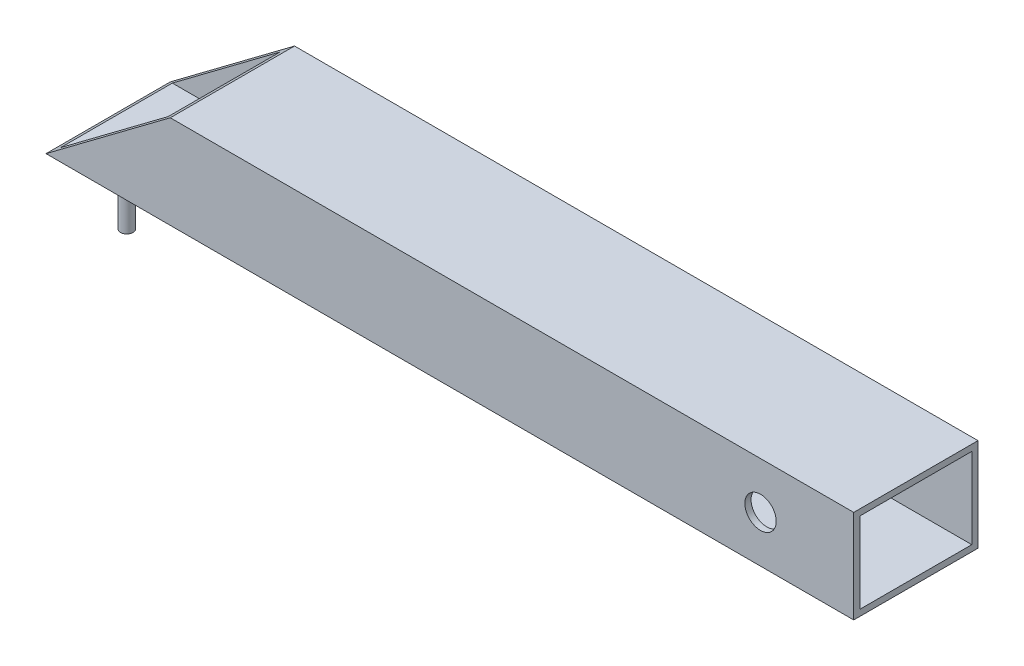
ISO-10303-21;
HEADER;
FILE_DESCRIPTION(('STEP AP214'),'2;1');
FILE_NAME('part.step','',(''),(''),'','','');
FILE_SCHEMA(('AUTOMOTIVE_DESIGN { 1 0 10303 214 1 1 1 1 }'));
ENDSEC;
DATA;
#1=APPLICATION_CONTEXT('core data for automotive mechanical design processes');
#2=APPLICATION_PROTOCOL_DEFINITION('international standard','automotive_design',2000,#1);
#3=PRODUCT_CONTEXT('',#1,'mechanical');
#4=PRODUCT('Part','Part','',(#3));
#5=PRODUCT_RELATED_PRODUCT_CATEGORY('part','',(#4));
#6=PRODUCT_DEFINITION_FORMATION('','',#4);
#7=PRODUCT_DEFINITION_CONTEXT('part definition',#1,'design');
#8=PRODUCT_DEFINITION('design','',#6,#7);
#9=PRODUCT_DEFINITION_SHAPE('','',#8);
#10=(LENGTH_UNIT() NAMED_UNIT(*) SI_UNIT(.MILLI.,.METRE.));
#11=(NAMED_UNIT(*) PLANE_ANGLE_UNIT() SI_UNIT($,.RADIAN.));
#12=(NAMED_UNIT(*) SI_UNIT($,.STERADIAN.) SOLID_ANGLE_UNIT());
#13=UNCERTAINTY_MEASURE_WITH_UNIT(LENGTH_MEASURE(1.E-05),#10,'distance_accuracy_value','');
#14=(GEOMETRIC_REPRESENTATION_CONTEXT(3) GLOBAL_UNCERTAINTY_ASSIGNED_CONTEXT((#13)) GLOBAL_UNIT_ASSIGNED_CONTEXT((#10,
#11,#12)) REPRESENTATION_CONTEXT('',''));
#15=CARTESIAN_POINT('',(0.,0.,0.));
#16=DIRECTION('',(0.,0.,1.));
#17=DIRECTION('',(1.,0.,0.));
#18=AXIS2_PLACEMENT_3D('',#15,#16,#17);
#19=CARTESIAN_POINT('',(0.,0.,-2.));
#20=DIRECTION('',(0.,0.,1.));
#21=DIRECTION('',(1.,0.,0.));
#22=AXIS2_PLACEMENT_3D('',#19,#20,#21);
#23=CYLINDRICAL_SURFACE('',#22,2.5);
#24=CARTESIAN_POINT('',(0.,0.,-2.));
#25=DIRECTION('',(0.,0.,-1.));
#26=DIRECTION('',(-1.,0.,0.));
#27=AXIS2_PLACEMENT_3D('',#24,#25,#26);
#28=CIRCLE('',#27,2.5);
#29=CARTESIAN_POINT('',(-2.5,0.,-2.));
#30=VERTEX_POINT('',#29);
#31=EDGE_CURVE('E11',#30,#30,#28,.T.);
#32=ORIENTED_EDGE('',*,*,#31,.F.);
#33=EDGE_LOOP('',(#32));
#34=FACE_BOUND('',#33,.T.);
#35=CARTESIAN_POINT('',(0.,0.,0.));
#36=DIRECTION('',(0.,0.,-1.));
#37=DIRECTION('',(-1.,0.,0.));
#38=AXIS2_PLACEMENT_3D('',#35,#36,#37);
#39=CIRCLE('',#38,2.5);
#40=CARTESIAN_POINT('',(-2.5,0.,0.));
#41=VERTEX_POINT('',#40);
#42=EDGE_CURVE('E44',#41,#41,#39,.T.);
#43=ORIENTED_EDGE('',*,*,#42,.T.);
#44=EDGE_LOOP('',(#43));
#45=FACE_BOUND('',#44,.T.);
#46=ADVANCED_FACE('F41',(#34,#45),#23,.T.);
#47=CARTESIAN_POINT('',(0.,0.,-2.));
#48=DIRECTION('',(0.,0.,-1.));
#49=DIRECTION('',(-1.,0.,0.));
#50=AXIS2_PLACEMENT_3D('',#47,#48,#49);
#51=PLANE('',#50);
#52=ORIENTED_EDGE('',*,*,#31,.T.);
#53=EDGE_LOOP('',(#52));
#54=FACE_BOUND('',#53,.T.);
#55=ADVANCED_FACE('F56',(#54),#51,.T.);
#56=CARTESIAN_POINT('',(0.,0.,0.));
#57=DIRECTION('',(0.,0.,-1.));
#58=DIRECTION('',(-1.,0.,0.));
#59=AXIS2_PLACEMENT_3D('',#56,#57,#58);
#60=PLANE('',#59);
#61=ORIENTED_EDGE('',*,*,#42,.F.);
#62=EDGE_LOOP('',(#61));
#63=FACE_BOUND('',#62,.T.);
#64=ADVANCED_FACE('F54',(#63),#60,.F.);
#65=CLOSED_SHELL('',(#46,#55,#64));
#66=MANIFOLD_SOLID_BREP('B2',#65);
#67=CARTESIAN_POINT('',(0.,0.,20.));
#68=DIRECTION('',(0.,0.,-1.));
#69=DIRECTION('',(-1.,0.,0.));
#70=AXIS2_PLACEMENT_3D('',#67,#68,#69);
#71=CYLINDRICAL_SURFACE('',#70,2.52456582455564);
#72=CARTESIAN_POINT('',(0.,0.,19.));
#73=DIRECTION('',(0.,0.,1.));
#74=DIRECTION('',(1.,0.,0.));
#75=AXIS2_PLACEMENT_3D('',#72,#73,#74);
#76=CIRCLE('',#75,2.52456582455564);
#77=CARTESIAN_POINT('',(2.52456582455564,0.,19.));
#78=VERTEX_POINT('',#77);
#79=EDGE_CURVE('E177',#78,#78,#76,.T.);
#80=ORIENTED_EDGE('',*,*,#79,.F.);
#81=EDGE_LOOP('',(#80));
#82=FACE_BOUND('',#81,.T.);
#83=CARTESIAN_POINT('',(0.,0.,20.));
#84=DIRECTION('',(0.,0.,1.));
#85=DIRECTION('',(1.,0.,0.));
#86=AXIS2_PLACEMENT_3D('',#83,#84,#85);
#87=CIRCLE('',#86,2.52456582455564);
#88=CARTESIAN_POINT('',(2.52456582455564,0.,20.));
#89=VERTEX_POINT('',#88);
#90=EDGE_CURVE('E187',#89,#89,#87,.T.);
#91=ORIENTED_EDGE('',*,*,#90,.T.);
#92=EDGE_LOOP('',(#91));
#93=FACE_BOUND('',#92,.T.);
#94=ADVANCED_FACE('F82',(#82,#93),#71,.F.);
#95=CARTESIAN_POINT('',(0.,0.,20.));
#96=DIRECTION('',(0.,0.,-1.));
#97=DIRECTION('',(-1.,0.,0.));
#98=AXIS2_PLACEMENT_3D('',#95,#96,#97);
#99=PLANE('',#98);
#100=DIRECTION('',(-0.8,-0.6,0.));
#101=VECTOR('',#100,1.);
#102=CARTESIAN_POINT('',(-95.,7.49999999999999,20.));
#103=LINE('',#102,#101);
#104=CARTESIAN_POINT('',(-95.,7.49999999999999,20.));
#105=VERTEX_POINT('',#104);
#106=CARTESIAN_POINT('',(-115.,-7.50000000000002,20.));
#107=VERTEX_POINT('',#106);
#108=EDGE_CURVE('E193',#105,#107,#103,.T.);
#109=ORIENTED_EDGE('',*,*,#108,.T.);
#110=DIRECTION('',(1.,0.,0.));
#111=VECTOR('',#110,1.);
#112=CARTESIAN_POINT('',(15.,-7.5,20.));
#113=LINE('',#112,#111);
#114=CARTESIAN_POINT('',(15.,-7.5,20.));
#115=VERTEX_POINT('',#114);
#116=EDGE_CURVE('E196',#107,#115,#113,.T.);
#117=ORIENTED_EDGE('',*,*,#116,.T.);
#118=DIRECTION('',(0.,1.,0.));
#119=VECTOR('',#118,1.);
#120=CARTESIAN_POINT('',(15.,-7.5,20.));
#121=LINE('',#120,#119);
#122=CARTESIAN_POINT('',(15.,7.5,20.));
#123=VERTEX_POINT('',#122);
#124=EDGE_CURVE('E199',#115,#123,#121,.T.);
#125=ORIENTED_EDGE('',*,*,#124,.T.);
#126=DIRECTION('',(-1.,0.,0.));
#127=VECTOR('',#126,1.);
#128=CARTESIAN_POINT('',(15.,7.5,20.));
#129=LINE('',#128,#127);
#130=EDGE_CURVE('E201',#123,#105,#129,.T.);
#131=ORIENTED_EDGE('',*,*,#130,.T.);
#132=EDGE_LOOP('',(#109,#117,#125,#131));
#133=FACE_BOUND('',#132,.T.);
#134=ORIENTED_EDGE('',*,*,#90,.F.);
#135=EDGE_LOOP('',(#134));
#136=FACE_BOUND('',#135,.T.);
#137=ADVANCED_FACE('F251',(#133,#136),#99,.F.);
#138=CARTESIAN_POINT('',(0.,0.,0.));
#139=DIRECTION('',(0.,0.,-1.));
#140=DIRECTION('',(-1.,0.,0.));
#141=AXIS2_PLACEMENT_3D('',#138,#139,#140);
#142=PLANE('',#141);
#143=DIRECTION('',(-0.8,-0.6,0.));
#144=VECTOR('',#143,1.);
#145=CARTESIAN_POINT('',(-95.,7.49999999999999,0.));
#146=LINE('',#145,#144);
#147=CARTESIAN_POINT('',(-95.,7.49999999999999,0.));
#148=VERTEX_POINT('',#147);
#149=CARTESIAN_POINT('',(-115.,-7.50000000000002,0.));
#150=VERTEX_POINT('',#149);
#151=EDGE_CURVE('E190',#148,#150,#146,.T.);
#152=ORIENTED_EDGE('',*,*,#151,.F.);
#153=DIRECTION('',(-1.,0.,0.));
#154=VECTOR('',#153,1.);
#155=CARTESIAN_POINT('',(15.,7.5,0.));
#156=LINE('',#155,#154);
#157=CARTESIAN_POINT('',(15.,7.5,0.));
#158=VERTEX_POINT('',#157);
#159=EDGE_CURVE('E197',#158,#148,#156,.T.);
#160=ORIENTED_EDGE('',*,*,#159,.F.);
#161=DIRECTION('',(0.,1.,0.));
#162=VECTOR('',#161,1.);
#163=CARTESIAN_POINT('',(15.,-7.5,0.));
#164=LINE('',#163,#162);
#165=CARTESIAN_POINT('',(15.,-7.5,0.));
#166=VERTEX_POINT('',#165);
#167=EDGE_CURVE('E208',#166,#158,#164,.T.);
#168=ORIENTED_EDGE('',*,*,#167,.F.);
#169=DIRECTION('',(1.,0.,0.));
#170=VECTOR('',#169,1.);
#171=CARTESIAN_POINT('',(15.,-7.5,0.));
#172=LINE('',#171,#170);
#173=EDGE_CURVE('E206',#150,#166,#172,.T.);
#174=ORIENTED_EDGE('',*,*,#173,.F.);
#175=EDGE_LOOP('',(#152,#160,#168,#174));
#176=FACE_BOUND('',#175,.T.);
#177=CARTESIAN_POINT('',(0.,0.,0.));
#178=DIRECTION('',(0.,0.,1.));
#179=DIRECTION('',(1.,0.,0.));
#180=AXIS2_PLACEMENT_3D('',#177,#178,#179);
#181=CIRCLE('',#180,2.52456582455564);
#182=CARTESIAN_POINT('',(2.52456582455564,0.,0.));
#183=VERTEX_POINT('',#182);
#184=EDGE_CURVE('E186',#183,#183,#181,.T.);
#185=ORIENTED_EDGE('',*,*,#184,.T.);
#186=EDGE_LOOP('',(#185));
#187=FACE_BOUND('',#186,.T.);
#188=ADVANCED_FACE('F242',(#176,#187),#142,.T.);
#189=CARTESIAN_POINT('',(-95.,7.49999999999999,20.));
#190=DIRECTION('',(0.6,-0.8,0.));
#191=DIRECTION('',(0.8,0.6,0.));
#192=AXIS2_PLACEMENT_3D('',#189,#190,#191);
#193=PLANE('',#192);
#194=DIRECTION('',(0.,0.,1.));
#195=VECTOR('',#194,1.);
#196=CARTESIAN_POINT('',(-96.3333333333333,6.5,20.));
#197=LINE('',#196,#195);
#198=CARTESIAN_POINT('',(-96.3333333333334,6.49999999999998,1.));
#199=VERTEX_POINT('',#198);
#200=CARTESIAN_POINT('',(-96.3333333333333,6.5,19.));
#201=VERTEX_POINT('',#200);
#202=EDGE_CURVE('E183',#199,#201,#197,.T.);
#203=ORIENTED_EDGE('',*,*,#202,.T.);
#204=DIRECTION('',(-0.8,-0.6,0.));
#205=VECTOR('',#204,1.);
#206=CARTESIAN_POINT('',(-95.,7.49999999999999,19.));
#207=LINE('',#206,#205);
#208=CARTESIAN_POINT('',(-113.666666666667,-6.5,19.));
#209=VERTEX_POINT('',#208);
#210=EDGE_CURVE('E178',#201,#209,#207,.T.);
#211=ORIENTED_EDGE('',*,*,#210,.T.);
#212=DIRECTION('',(0.,0.,-1.));
#213=VECTOR('',#212,1.);
#214=CARTESIAN_POINT('',(-113.666666666667,-6.5,20.));
#215=LINE('',#214,#213);
#216=CARTESIAN_POINT('',(-113.666666666667,-6.5,1.));
#217=VERTEX_POINT('',#216);
#218=EDGE_CURVE('E181',#209,#217,#215,.T.);
#219=ORIENTED_EDGE('',*,*,#218,.T.);
#220=DIRECTION('',(0.8,0.6,0.));
#221=VECTOR('',#220,1.);
#222=CARTESIAN_POINT('',(-95.,7.49999999999999,1.));
#223=LINE('',#222,#221);
#224=EDGE_CURVE('E153',#217,#199,#223,.T.);
#225=ORIENTED_EDGE('',*,*,#224,.T.);
#226=EDGE_LOOP('',(#203,#211,#219,#225));
#227=FACE_BOUND('',#226,.T.);
#228=ORIENTED_EDGE('',*,*,#151,.T.);
#229=DIRECTION('',(0.,0.,-1.));
#230=VECTOR('',#229,1.);
#231=CARTESIAN_POINT('',(-115.,-7.50000000000002,20.));
#232=LINE('',#231,#230);
#233=EDGE_CURVE('E219',#107,#150,#232,.T.);
#234=ORIENTED_EDGE('',*,*,#233,.F.);
#235=ORIENTED_EDGE('',*,*,#108,.F.);
#236=DIRECTION('',(0.,0.,-1.));
#237=VECTOR('',#236,1.);
#238=CARTESIAN_POINT('',(-95.,7.49999999999999,20.));
#239=LINE('',#238,#237);
#240=EDGE_CURVE('E203',#105,#148,#239,.T.);
#241=ORIENTED_EDGE('',*,*,#240,.T.);
#242=EDGE_LOOP('',(#228,#234,#235,#241));
#243=FACE_BOUND('',#242,.T.);
#244=ADVANCED_FACE('F84',(#227,#243),#193,.F.);
#245=CARTESIAN_POINT('',(15.,-7.5,20.));
#246=DIRECTION('',(0.,1.,0.));
#247=DIRECTION('',(-1.,0.,0.));
#248=AXIS2_PLACEMENT_3D('',#245,#246,#247);
#249=PLANE('',#248);
#250=CARTESIAN_POINT('',(-107.,-7.50000000000002,5.));
#251=DIRECTION('',(0.,1.,0.));
#252=DIRECTION('',(-1.,0.,0.));
#253=AXIS2_PLACEMENT_3D('',#250,#251,#252);
#254=CIRCLE('',#253,0.999999999999998);
#255=CARTESIAN_POINT('',(-108.,-7.50000000000002,5.));
#256=VERTEX_POINT('',#255);
#257=EDGE_CURVE('E39',#256,#256,#254,.F.);
#258=ORIENTED_EDGE('',*,*,#257,.F.);
#259=EDGE_LOOP('',(#258));
#260=FACE_BOUND('',#259,.T.);
#261=CARTESIAN_POINT('',(-107.,-7.50000000000002,15.));
#262=DIRECTION('',(0.,1.,0.));
#263=DIRECTION('',(-1.,0.,0.));
#264=AXIS2_PLACEMENT_3D('',#261,#262,#263);
#265=CIRCLE('',#264,0.999999999999998);
#266=CARTESIAN_POINT('',(-108.,-7.50000000000002,15.));
#267=VERTEX_POINT('',#266);
#268=EDGE_CURVE('E90',#267,#267,#265,.F.);
#269=ORIENTED_EDGE('',*,*,#268,.F.);
#270=EDGE_LOOP('',(#269));
#271=FACE_BOUND('',#270,.T.);
#272=ORIENTED_EDGE('',*,*,#173,.T.);
#273=DIRECTION('',(0.,0.,-1.));
#274=VECTOR('',#273,1.);
#275=CARTESIAN_POINT('',(15.,-7.5,20.));
#276=LINE('',#275,#274);
#277=EDGE_CURVE('E216',#115,#166,#276,.T.);
#278=ORIENTED_EDGE('',*,*,#277,.F.);
#279=ORIENTED_EDGE('',*,*,#116,.F.);
#280=ORIENTED_EDGE('',*,*,#233,.T.);
#281=EDGE_LOOP('',(#272,#278,#279,#280));
#282=FACE_BOUND('',#281,.T.);
#283=ADVANCED_FACE('F230',(#260,#271,#282),#249,.F.);
#284=CARTESIAN_POINT('',(15.,-7.5,20.));
#285=DIRECTION('',(-1.,0.,0.));
#286=DIRECTION('',(0.,0.,1.));
#287=AXIS2_PLACEMENT_3D('',#284,#285,#286);
#288=PLANE('',#287);
#289=DIRECTION('',(0.,0.,-1.));
#290=VECTOR('',#289,1.);
#291=CARTESIAN_POINT('',(15.,-6.5,19.));
#292=LINE('',#291,#290);
#293=CARTESIAN_POINT('',(15.,-6.5,19.));
#294=VERTEX_POINT('',#293);
#295=CARTESIAN_POINT('',(15.,-6.5,0.999999999999999));
#296=VERTEX_POINT('',#295);
#297=EDGE_CURVE('E159',#294,#296,#292,.T.);
#298=ORIENTED_EDGE('',*,*,#297,.F.);
#299=DIRECTION('',(0.,-1.,0.));
#300=VECTOR('',#299,1.);
#301=CARTESIAN_POINT('',(15.,6.5,19.));
#302=LINE('',#301,#300);
#303=CARTESIAN_POINT('',(15.,6.5,19.));
#304=VERTEX_POINT('',#303);
#305=EDGE_CURVE('E105',#304,#294,#302,.T.);
#306=ORIENTED_EDGE('',*,*,#305,.F.);
#307=DIRECTION('',(0.,0.,1.));
#308=VECTOR('',#307,1.);
#309=CARTESIAN_POINT('',(15.,6.5,19.));
#310=LINE('',#309,#308);
#311=CARTESIAN_POINT('',(15.,6.5,1.));
#312=VERTEX_POINT('',#311);
#313=EDGE_CURVE('E166',#312,#304,#310,.T.);
#314=ORIENTED_EDGE('',*,*,#313,.F.);
#315=DIRECTION('',(0.,1.,0.));
#316=VECTOR('',#315,1.);
#317=CARTESIAN_POINT('',(15.,6.5,1.));
#318=LINE('',#317,#316);
#319=EDGE_CURVE('E150',#296,#312,#318,.T.);
#320=ORIENTED_EDGE('',*,*,#319,.F.);
#321=EDGE_LOOP('',(#298,#306,#314,#320));
#322=FACE_BOUND('',#321,.T.);
#323=ORIENTED_EDGE('',*,*,#167,.T.);
#324=DIRECTION('',(0.,0.,-1.));
#325=VECTOR('',#324,1.);
#326=CARTESIAN_POINT('',(15.,7.5,20.));
#327=LINE('',#326,#325);
#328=EDGE_CURVE('E213',#123,#158,#327,.T.);
#329=ORIENTED_EDGE('',*,*,#328,.F.);
#330=ORIENTED_EDGE('',*,*,#124,.F.);
#331=ORIENTED_EDGE('',*,*,#277,.T.);
#332=EDGE_LOOP('',(#323,#329,#330,#331));
#333=FACE_BOUND('',#332,.T.);
#334=ADVANCED_FACE('F163',(#322,#333),#288,.F.);
#335=CARTESIAN_POINT('',(15.,7.5,20.));
#336=DIRECTION('',(0.,-1.,0.));
#337=DIRECTION('',(1.,0.,0.));
#338=AXIS2_PLACEMENT_3D('',#335,#336,#337);
#339=PLANE('',#338);
#340=ORIENTED_EDGE('',*,*,#159,.T.);
#341=ORIENTED_EDGE('',*,*,#240,.F.);
#342=ORIENTED_EDGE('',*,*,#130,.F.);
#343=ORIENTED_EDGE('',*,*,#328,.T.);
#344=EDGE_LOOP('',(#340,#341,#342,#343));
#345=FACE_BOUND('',#344,.T.);
#346=ADVANCED_FACE('F246',(#345),#339,.F.);
#347=CARTESIAN_POINT('',(0.,0.,1.));
#348=DIRECTION('',(0.,0.,-1.));
#349=DIRECTION('',(0.,1.,0.));
#350=AXIS2_PLACEMENT_3D('',#347,#348,#349);
#351=CIRCLE('',#350,2.52456582455564);
#352=CARTESIAN_POINT('',(0.,2.52456582455564,1.));
#353=VERTEX_POINT('',#352);
#354=EDGE_CURVE('E173',#353,#353,#351,.T.);
#355=ORIENTED_EDGE('',*,*,#354,.F.);
#356=EDGE_LOOP('',(#355));
#357=FACE_BOUND('',#356,.T.);
#358=ORIENTED_EDGE('',*,*,#184,.F.);
#359=EDGE_LOOP('',(#358));
#360=FACE_BOUND('',#359,.T.);
#361=ADVANCED_FACE('F260',(#357,#360),#71,.F.);
#362=CARTESIAN_POINT('',(-185.,6.5,19.));
#363=DIRECTION('',(0.,1.,0.));
#364=DIRECTION('',(0.,0.,1.));
#365=AXIS2_PLACEMENT_3D('',#362,#363,#364);
#366=PLANE('',#365);
#367=DIRECTION('',(1.,0.,0.));
#368=VECTOR('',#367,1.);
#369=CARTESIAN_POINT('',(-185.,6.5,1.));
#370=LINE('',#369,#368);
#371=EDGE_CURVE('E155',#199,#312,#370,.T.);
#372=ORIENTED_EDGE('',*,*,#371,.T.);
#373=ORIENTED_EDGE('',*,*,#313,.T.);
#374=DIRECTION('',(1.,0.,0.));
#375=VECTOR('',#374,1.);
#376=CARTESIAN_POINT('',(-185.,6.5,19.));
#377=LINE('',#376,#375);
#378=EDGE_CURVE('E171',#201,#304,#377,.T.);
#379=ORIENTED_EDGE('',*,*,#378,.F.);
#380=ORIENTED_EDGE('',*,*,#202,.F.);
#381=EDGE_LOOP('',(#372,#373,#379,#380));
#382=FACE_BOUND('',#381,.T.);
#383=ADVANCED_FACE('F266',(#382),#366,.F.);
#384=CARTESIAN_POINT('',(-185.,-6.5,19.));
#385=DIRECTION('',(0.,-1.,0.));
#386=DIRECTION('',(0.,0.,-1.));
#387=AXIS2_PLACEMENT_3D('',#384,#385,#386);
#388=PLANE('',#387);
#389=DIRECTION('',(1.,0.,0.));
#390=VECTOR('',#389,1.);
#391=CARTESIAN_POINT('',(-185.,-6.5,19.));
#392=LINE('',#391,#390);
#393=EDGE_CURVE('E156',#209,#294,#392,.T.);
#394=ORIENTED_EDGE('',*,*,#393,.T.);
#395=ORIENTED_EDGE('',*,*,#297,.T.);
#396=DIRECTION('',(1.,0.,0.));
#397=VECTOR('',#396,1.);
#398=CARTESIAN_POINT('',(-185.,-6.5,0.999999999999999));
#399=LINE('',#398,#397);
#400=EDGE_CURVE('E97',#217,#296,#399,.T.);
#401=ORIENTED_EDGE('',*,*,#400,.F.);
#402=ORIENTED_EDGE('',*,*,#218,.F.);
#403=EDGE_LOOP('',(#394,#395,#401,#402));
#404=FACE_BOUND('',#403,.T.);
#405=ADVANCED_FACE('F160',(#404),#388,.F.);
#406=CARTESIAN_POINT('',(-185.,6.5,19.));
#407=DIRECTION('',(0.,0.,1.));
#408=DIRECTION('',(1.,0.,0.));
#409=AXIS2_PLACEMENT_3D('',#406,#407,#408);
#410=PLANE('',#409);
#411=ORIENTED_EDGE('',*,*,#79,.T.);
#412=EDGE_LOOP('',(#411));
#413=FACE_BOUND('',#412,.T.);
#414=ORIENTED_EDGE('',*,*,#378,.T.);
#415=ORIENTED_EDGE('',*,*,#305,.T.);
#416=ORIENTED_EDGE('',*,*,#393,.F.);
#417=ORIENTED_EDGE('',*,*,#210,.F.);
#418=EDGE_LOOP('',(#414,#415,#416,#417));
#419=FACE_BOUND('',#418,.T.);
#420=ADVANCED_FACE('F369',(#413,#419),#410,.F.);
#421=CARTESIAN_POINT('',(-185.,6.5,1.));
#422=DIRECTION('',(0.,0.,-1.));
#423=DIRECTION('',(0.,1.,0.));
#424=AXIS2_PLACEMENT_3D('',#421,#422,#423);
#425=PLANE('',#424);
#426=ORIENTED_EDGE('',*,*,#354,.T.);
#427=EDGE_LOOP('',(#426));
#428=FACE_BOUND('',#427,.T.);
#429=ORIENTED_EDGE('',*,*,#400,.T.);
#430=ORIENTED_EDGE('',*,*,#319,.T.);
#431=ORIENTED_EDGE('',*,*,#371,.F.);
#432=ORIENTED_EDGE('',*,*,#224,.F.);
#433=EDGE_LOOP('',(#429,#430,#431,#432));
#434=FACE_BOUND('',#433,.T.);
#435=ADVANCED_FACE('F147',(#428,#434),#425,.F.);
#436=CARTESIAN_POINT('',(-107.,-16.5,15.));
#437=DIRECTION('',(0.,1.,0.));
#438=DIRECTION('',(-1.,0.,0.));
#439=AXIS2_PLACEMENT_3D('',#436,#437,#438);
#440=CYLINDRICAL_SURFACE('',#439,0.999999999999998);
#441=CARTESIAN_POINT('',(-107.,-16.5,15.));
#442=DIRECTION('',(0.,-1.,0.));
#443=DIRECTION('',(1.,0.,0.));
#444=AXIS2_PLACEMENT_3D('',#441,#442,#443);
#445=CIRCLE('',#444,0.999999999999998);
#446=CARTESIAN_POINT('',(-106.,-16.5,15.));
#447=VERTEX_POINT('',#446);
#448=EDGE_CURVE('E376',#447,#447,#445,.T.);
#449=ORIENTED_EDGE('',*,*,#448,.F.);
#450=EDGE_LOOP('',(#449));
#451=FACE_BOUND('',#450,.T.);
#452=ORIENTED_EDGE('',*,*,#268,.T.);
#453=EDGE_LOOP('',(#452));
#454=FACE_BOUND('',#453,.T.);
#455=ADVANCED_FACE('F228',(#451,#454),#440,.T.);
#456=CARTESIAN_POINT('',(-107.,-16.5,15.));
#457=DIRECTION('',(0.,-1.,0.));
#458=DIRECTION('',(1.,0.,0.));
#459=AXIS2_PLACEMENT_3D('',#456,#457,#458);
#460=PLANE('',#459);
#461=ORIENTED_EDGE('',*,*,#448,.T.);
#462=EDGE_LOOP('',(#461));
#463=FACE_BOUND('',#462,.T.);
#464=ADVANCED_FACE('F332',(#463),#460,.T.);
#465=CARTESIAN_POINT('',(-107.,-16.5,5.));
#466=DIRECTION('',(0.,1.,0.));
#467=DIRECTION('',(-1.,0.,0.));
#468=AXIS2_PLACEMENT_3D('',#465,#466,#467);
#469=CYLINDRICAL_SURFACE('',#468,0.999999999999998);
#470=CARTESIAN_POINT('',(-107.,-16.5,5.));
#471=DIRECTION('',(0.,-1.,0.));
#472=DIRECTION('',(1.,0.,0.));
#473=AXIS2_PLACEMENT_3D('',#470,#471,#472);
#474=CIRCLE('',#473,0.999999999999998);
#475=CARTESIAN_POINT('',(-106.,-16.5,5.));
#476=VERTEX_POINT('',#475);
#477=EDGE_CURVE('E378',#476,#476,#474,.T.);
#478=ORIENTED_EDGE('',*,*,#477,.F.);
#479=EDGE_LOOP('',(#478));
#480=FACE_BOUND('',#479,.T.);
#481=ORIENTED_EDGE('',*,*,#257,.T.);
#482=EDGE_LOOP('',(#481));
#483=FACE_BOUND('',#482,.T.);
#484=ADVANCED_FACE('F342',(#480,#483),#469,.T.);
#485=CARTESIAN_POINT('',(-107.,-16.5,5.));
#486=DIRECTION('',(0.,-1.,0.));
#487=DIRECTION('',(1.,0.,0.));
#488=AXIS2_PLACEMENT_3D('',#485,#486,#487);
#489=PLANE('',#488);
#490=ORIENTED_EDGE('',*,*,#477,.T.);
#491=EDGE_LOOP('',(#490));
#492=FACE_BOUND('',#491,.T.);
#493=ADVANCED_FACE('F352',(#492),#489,.T.);
#494=CLOSED_SHELL('',(#94,#137,#188,#244,#283,#334,#346,#361,#383,#405,#420,#435,#455,#464,#484,#493));
#495=MANIFOLD_SOLID_BREP('B6',#494);
#496=ADVANCED_BREP_SHAPE_REPRESENTATION('',(#18,#66,#495),#14);
#497=SHAPE_DEFINITION_REPRESENTATION(#9,#496);
ENDSEC;
END-ISO-10303-21;
